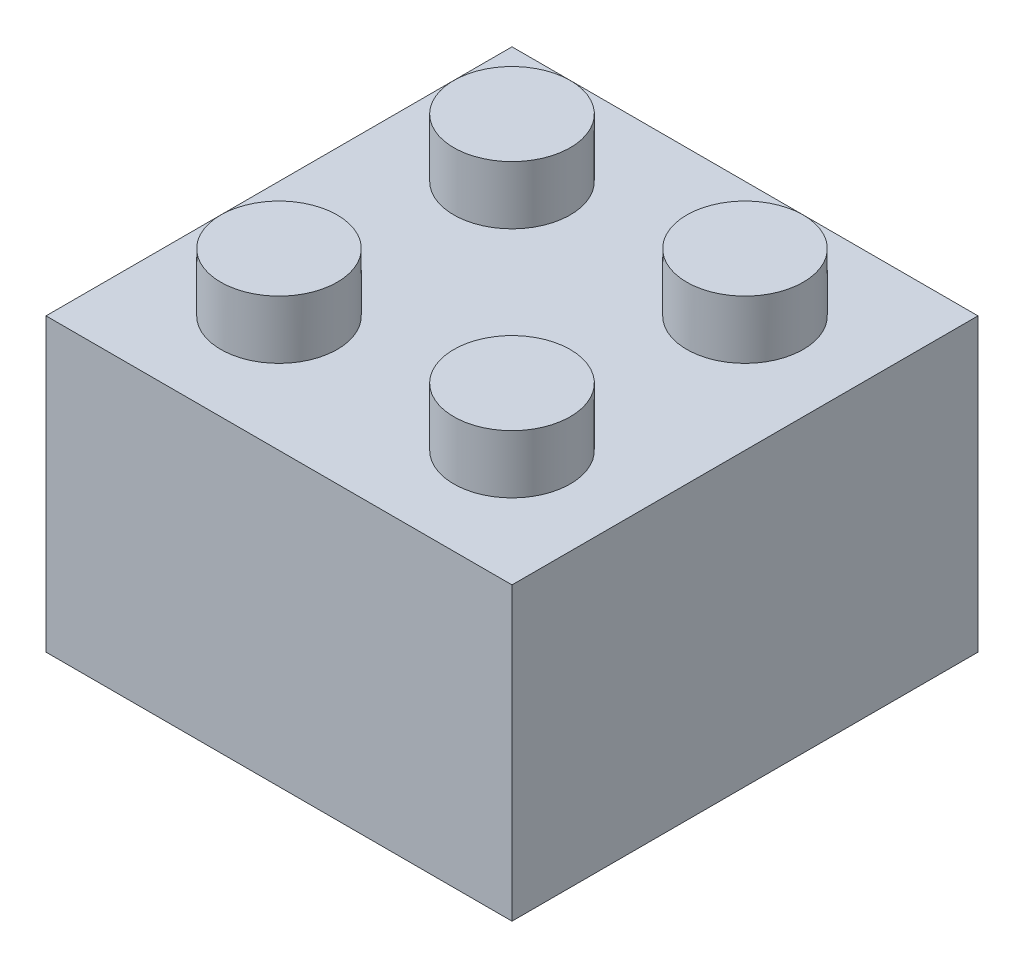
ISO-10303-21;
HEADER;
FILE_DESCRIPTION(('STEP AP214'),'2;1');
FILE_NAME('part.step','',(''),(''),'','','');
FILE_SCHEMA(('AUTOMOTIVE_DESIGN { 1 0 10303 214 1 1 1 1 }'));
ENDSEC;
DATA;
#1=APPLICATION_CONTEXT('core data for automotive mechanical design processes');
#2=APPLICATION_PROTOCOL_DEFINITION('international standard','automotive_design',2000,#1);
#3=PRODUCT_CONTEXT('',#1,'mechanical');
#4=PRODUCT('Part','Part','',(#3));
#5=PRODUCT_RELATED_PRODUCT_CATEGORY('part','',(#4));
#6=PRODUCT_DEFINITION_FORMATION('','',#4);
#7=PRODUCT_DEFINITION_CONTEXT('part definition',#1,'design');
#8=PRODUCT_DEFINITION('design','',#6,#7);
#9=PRODUCT_DEFINITION_SHAPE('','',#8);
#10=(LENGTH_UNIT() NAMED_UNIT(*) SI_UNIT(.MILLI.,.METRE.));
#11=(NAMED_UNIT(*) PLANE_ANGLE_UNIT() SI_UNIT($,.RADIAN.));
#12=(NAMED_UNIT(*) SI_UNIT($,.STERADIAN.) SOLID_ANGLE_UNIT());
#13=UNCERTAINTY_MEASURE_WITH_UNIT(LENGTH_MEASURE(1.E-05),#10,'distance_accuracy_value','');
#14=(GEOMETRIC_REPRESENTATION_CONTEXT(3) GLOBAL_UNCERTAINTY_ASSIGNED_CONTEXT((#13)) GLOBAL_UNIT_ASSIGNED_CONTEXT((#10,
#11,#12)) REPRESENTATION_CONTEXT('',''));
#15=CARTESIAN_POINT('',(0.,0.,0.));
#16=DIRECTION('',(0.,0.,1.));
#17=DIRECTION('',(1.,0.,0.));
#18=AXIS2_PLACEMENT_3D('',#15,#16,#17);
#19=CARTESIAN_POINT('',(-8.,10.,-8.));
#20=DIRECTION('',(0.,0.,-1.));
#21=DIRECTION('',(-1.,0.,0.));
#22=AXIS2_PLACEMENT_3D('',#19,#20,#21);
#23=PLANE('',#22);
#24=DIRECTION('',(1.,0.,0.));
#25=VECTOR('',#24,1.);
#26=CARTESIAN_POINT('',(-8.,0.,-8.));
#27=LINE('',#26,#25);
#28=CARTESIAN_POINT('',(-8.,0.,-8.));
#29=VERTEX_POINT('',#28);
#30=CARTESIAN_POINT('',(8.,0.,-8.));
#31=VERTEX_POINT('',#30);
#32=EDGE_CURVE('E186',#29,#31,#27,.T.);
#33=ORIENTED_EDGE('',*,*,#32,.F.);
#34=DIRECTION('',(0.,-1.,0.));
#35=VECTOR('',#34,1.);
#36=CARTESIAN_POINT('',(-8.,10.,-8.));
#37=LINE('',#36,#35);
#38=CARTESIAN_POINT('',(-8.,10.,-8.));
#39=VERTEX_POINT('',#38);
#40=EDGE_CURVE('E60',#39,#29,#37,.T.);
#41=ORIENTED_EDGE('',*,*,#40,.F.);
#42=DIRECTION('',(1.,0.,0.));
#43=VECTOR('',#42,1.);
#44=CARTESIAN_POINT('',(-8.,10.,-8.));
#45=LINE('',#44,#43);
#46=CARTESIAN_POINT('',(8.,10.,-8.));
#47=VERTEX_POINT('',#46);
#48=EDGE_CURVE('E187',#39,#47,#45,.T.);
#49=ORIENTED_EDGE('',*,*,#48,.T.);
#50=DIRECTION('',(0.,-1.,0.));
#51=VECTOR('',#50,1.);
#52=CARTESIAN_POINT('',(8.,10.,-8.));
#53=LINE('',#52,#51);
#54=EDGE_CURVE('E85',#47,#31,#53,.T.);
#55=ORIENTED_EDGE('',*,*,#54,.T.);
#56=EDGE_LOOP('',(#33,#41,#49,#55));
#57=FACE_BOUND('',#56,.T.);
#58=ADVANCED_FACE('F37',(#57),#23,.T.);
#59=CARTESIAN_POINT('',(-8.,10.,-8.));
#60=DIRECTION('',(1.,0.,0.));
#61=DIRECTION('',(0.,0.,-1.));
#62=AXIS2_PLACEMENT_3D('',#59,#60,#61);
#63=PLANE('',#62);
#64=DIRECTION('',(0.,0.,1.));
#65=VECTOR('',#64,1.);
#66=CARTESIAN_POINT('',(-8.,0.,-8.));
#67=LINE('',#66,#65);
#68=CARTESIAN_POINT('',(-8.,0.,8.));
#69=VERTEX_POINT('',#68);
#70=EDGE_CURVE('E190',#29,#69,#67,.T.);
#71=ORIENTED_EDGE('',*,*,#70,.T.);
#72=DIRECTION('',(0.,-1.,0.));
#73=VECTOR('',#72,1.);
#74=CARTESIAN_POINT('',(-8.,10.,8.));
#75=LINE('',#74,#73);
#76=CARTESIAN_POINT('',(-8.,10.,8.));
#77=VERTEX_POINT('',#76);
#78=EDGE_CURVE('E207',#77,#69,#75,.T.);
#79=ORIENTED_EDGE('',*,*,#78,.F.);
#80=DIRECTION('',(0.,0.,1.));
#81=VECTOR('',#80,1.);
#82=CARTESIAN_POINT('',(-8.,10.,-8.));
#83=LINE('',#82,#81);
#84=EDGE_CURVE('E194',#39,#77,#83,.T.);
#85=ORIENTED_EDGE('',*,*,#84,.F.);
#86=ORIENTED_EDGE('',*,*,#40,.T.);
#87=EDGE_LOOP('',(#71,#79,#85,#86));
#88=FACE_BOUND('',#87,.T.);
#89=ADVANCED_FACE('F242',(#88),#63,.F.);
#90=CARTESIAN_POINT('',(-8.,10.,8.));
#91=DIRECTION('',(0.,0.,-1.));
#92=DIRECTION('',(-1.,0.,0.));
#93=AXIS2_PLACEMENT_3D('',#90,#91,#92);
#94=PLANE('',#93);
#95=DIRECTION('',(1.,0.,0.));
#96=VECTOR('',#95,1.);
#97=CARTESIAN_POINT('',(-8.,0.,8.));
#98=LINE('',#97,#96);
#99=CARTESIAN_POINT('',(8.,0.,8.));
#100=VERTEX_POINT('',#99);
#101=EDGE_CURVE('E201',#69,#100,#98,.T.);
#102=ORIENTED_EDGE('',*,*,#101,.T.);
#103=DIRECTION('',(0.,-1.,0.));
#104=VECTOR('',#103,1.);
#105=CARTESIAN_POINT('',(8.,10.,8.));
#106=LINE('',#105,#104);
#107=CARTESIAN_POINT('',(8.,10.,8.));
#108=VERTEX_POINT('',#107);
#109=EDGE_CURVE('E210',#108,#100,#106,.T.);
#110=ORIENTED_EDGE('',*,*,#109,.F.);
#111=DIRECTION('',(1.,0.,0.));
#112=VECTOR('',#111,1.);
#113=CARTESIAN_POINT('',(-8.,10.,8.));
#114=LINE('',#113,#112);
#115=EDGE_CURVE('E192',#77,#108,#114,.T.);
#116=ORIENTED_EDGE('',*,*,#115,.F.);
#117=ORIENTED_EDGE('',*,*,#78,.T.);
#118=EDGE_LOOP('',(#102,#110,#116,#117));
#119=FACE_BOUND('',#118,.T.);
#120=ADVANCED_FACE('F245',(#119),#94,.F.);
#121=CARTESIAN_POINT('',(8.,10.,-8.));
#122=DIRECTION('',(1.,0.,0.));
#123=DIRECTION('',(0.,0.,-1.));
#124=AXIS2_PLACEMENT_3D('',#121,#122,#123);
#125=PLANE('',#124);
#126=DIRECTION('',(0.,0.,1.));
#127=VECTOR('',#126,1.);
#128=CARTESIAN_POINT('',(8.,0.,-8.));
#129=LINE('',#128,#127);
#130=EDGE_CURVE('E198',#31,#100,#129,.T.);
#131=ORIENTED_EDGE('',*,*,#130,.F.);
#132=ORIENTED_EDGE('',*,*,#54,.F.);
#133=DIRECTION('',(0.,0.,1.));
#134=VECTOR('',#133,1.);
#135=CARTESIAN_POINT('',(8.,10.,-8.));
#136=LINE('',#135,#134);
#137=EDGE_CURVE('E189',#47,#108,#136,.T.);
#138=ORIENTED_EDGE('',*,*,#137,.T.);
#139=ORIENTED_EDGE('',*,*,#109,.T.);
#140=EDGE_LOOP('',(#131,#132,#138,#139));
#141=FACE_BOUND('',#140,.T.);
#142=ADVANCED_FACE('F229',(#141),#125,.T.);
#143=CARTESIAN_POINT('',(0.,10.,0.));
#144=DIRECTION('',(0.,-1.,0.));
#145=DIRECTION('',(0.,0.,-1.));
#146=AXIS2_PLACEMENT_3D('',#143,#144,#145);
#147=PLANE('',#146);
#148=CARTESIAN_POINT('',(-4.,10.,4.));
#149=DIRECTION('',(0.,-1.,0.));
#150=DIRECTION('',(0.,0.,-1.));
#151=AXIS2_PLACEMENT_3D('',#148,#149,#150);
#152=CIRCLE('',#151,2.);
#153=CARTESIAN_POINT('',(-4.,10.,2.));
#154=VERTEX_POINT('',#153);
#155=EDGE_CURVE('E44',#154,#154,#152,.F.);
#156=ORIENTED_EDGE('',*,*,#155,.F.);
#157=EDGE_LOOP('',(#156));
#158=FACE_BOUND('',#157,.T.);
#159=CARTESIAN_POINT('',(4.,10.,4.));
#160=DIRECTION('',(0.,-1.,0.));
#161=DIRECTION('',(0.,0.,-1.));
#162=AXIS2_PLACEMENT_3D('',#159,#160,#161);
#163=CIRCLE('',#162,2.);
#164=CARTESIAN_POINT('',(4.,10.,2.));
#165=VERTEX_POINT('',#164);
#166=EDGE_CURVE('E218',#165,#165,#163,.F.);
#167=ORIENTED_EDGE('',*,*,#166,.F.);
#168=EDGE_LOOP('',(#167));
#169=FACE_BOUND('',#168,.T.);
#170=CARTESIAN_POINT('',(-4.,10.,-4.));
#171=DIRECTION('',(0.,-1.,0.));
#172=DIRECTION('',(0.,0.,-1.));
#173=AXIS2_PLACEMENT_3D('',#170,#171,#172);
#174=CIRCLE('',#173,2.);
#175=CARTESIAN_POINT('',(-4.,10.,-6.));
#176=VERTEX_POINT('',#175);
#177=EDGE_CURVE('E215',#176,#176,#174,.F.);
#178=ORIENTED_EDGE('',*,*,#177,.F.);
#179=EDGE_LOOP('',(#178));
#180=FACE_BOUND('',#179,.T.);
#181=CARTESIAN_POINT('',(4.,10.,-4.));
#182=DIRECTION('',(0.,-1.,0.));
#183=DIRECTION('',(0.,0.,-1.));
#184=AXIS2_PLACEMENT_3D('',#181,#182,#183);
#185=CIRCLE('',#184,2.);
#186=CARTESIAN_POINT('',(4.,10.,-6.));
#187=VERTEX_POINT('',#186);
#188=EDGE_CURVE('E206',#187,#187,#185,.F.);
#189=ORIENTED_EDGE('',*,*,#188,.F.);
#190=EDGE_LOOP('',(#189));
#191=FACE_BOUND('',#190,.T.);
#192=ORIENTED_EDGE('',*,*,#48,.F.);
#193=ORIENTED_EDGE('',*,*,#84,.T.);
#194=ORIENTED_EDGE('',*,*,#115,.T.);
#195=ORIENTED_EDGE('',*,*,#137,.F.);
#196=EDGE_LOOP('',(#192,#193,#194,#195));
#197=FACE_BOUND('',#196,.T.);
#198=ADVANCED_FACE('F225',(#158,#169,#180,#191,#197),#147,.F.);
#199=CARTESIAN_POINT('',(0.,0.,0.));
#200=DIRECTION('',(0.,-1.,0.));
#201=DIRECTION('',(0.,0.,-1.));
#202=AXIS2_PLACEMENT_3D('',#199,#200,#201);
#203=PLANE('',#202);
#204=DIRECTION('',(1.,0.,0.));
#205=VECTOR('',#204,1.);
#206=CARTESIAN_POINT('',(0.,0.,-7.));
#207=LINE('',#206,#205);
#208=CARTESIAN_POINT('',(-7.,0.,-7.));
#209=VERTEX_POINT('',#208);
#210=CARTESIAN_POINT('',(7.,0.,-7.));
#211=VERTEX_POINT('',#210);
#212=EDGE_CURVE('E159',#209,#211,#207,.T.);
#213=ORIENTED_EDGE('',*,*,#212,.F.);
#214=DIRECTION('',(0.,0.,1.));
#215=VECTOR('',#214,1.);
#216=CARTESIAN_POINT('',(-7.,0.,0.));
#217=LINE('',#216,#215);
#218=CARTESIAN_POINT('',(-7.,0.,7.));
#219=VERTEX_POINT('',#218);
#220=EDGE_CURVE('E114',#209,#219,#217,.T.);
#221=ORIENTED_EDGE('',*,*,#220,.T.);
#222=DIRECTION('',(1.,0.,0.));
#223=VECTOR('',#222,1.);
#224=CARTESIAN_POINT('',(0.,0.,7.));
#225=LINE('',#224,#223);
#226=CARTESIAN_POINT('',(7.,0.,7.));
#227=VERTEX_POINT('',#226);
#228=EDGE_CURVE('E51',#219,#227,#225,.T.);
#229=ORIENTED_EDGE('',*,*,#228,.T.);
#230=DIRECTION('',(0.,0.,1.));
#231=VECTOR('',#230,1.);
#232=CARTESIAN_POINT('',(7.,0.,0.));
#233=LINE('',#232,#231);
#234=EDGE_CURVE('E171',#211,#227,#233,.T.);
#235=ORIENTED_EDGE('',*,*,#234,.F.);
#236=EDGE_LOOP('',(#213,#221,#229,#235));
#237=FACE_BOUND('',#236,.T.);
#238=ORIENTED_EDGE('',*,*,#32,.T.);
#239=ORIENTED_EDGE('',*,*,#130,.T.);
#240=ORIENTED_EDGE('',*,*,#101,.F.);
#241=ORIENTED_EDGE('',*,*,#70,.F.);
#242=EDGE_LOOP('',(#238,#239,#240,#241));
#243=FACE_BOUND('',#242,.T.);
#244=ADVANCED_FACE('F228',(#237,#243),#203,.T.);
#245=CARTESIAN_POINT('',(4.,12.,-4.));
#246=DIRECTION('',(0.,-1.,0.));
#247=DIRECTION('',(0.,0.,-1.));
#248=AXIS2_PLACEMENT_3D('',#245,#246,#247);
#249=CYLINDRICAL_SURFACE('',#248,2.);
#250=CARTESIAN_POINT('',(4.,12.,-4.));
#251=DIRECTION('',(0.,1.,0.));
#252=DIRECTION('',(0.,0.,1.));
#253=AXIS2_PLACEMENT_3D('',#250,#251,#252);
#254=CIRCLE('',#253,2.);
#255=CARTESIAN_POINT('',(4.,12.,-2.));
#256=VERTEX_POINT('',#255);
#257=EDGE_CURVE('E183',#256,#256,#254,.T.);
#258=ORIENTED_EDGE('',*,*,#257,.F.);
#259=EDGE_LOOP('',(#258));
#260=FACE_BOUND('',#259,.T.);
#261=ORIENTED_EDGE('',*,*,#188,.T.);
#262=EDGE_LOOP('',(#261));
#263=FACE_BOUND('',#262,.T.);
#264=ADVANCED_FACE('F287',(#260,#263),#249,.T.);
#265=CARTESIAN_POINT('',(4.,12.,-4.));
#266=DIRECTION('',(0.,1.,0.));
#267=DIRECTION('',(0.,0.,1.));
#268=AXIS2_PLACEMENT_3D('',#265,#266,#267);
#269=PLANE('',#268);
#270=ORIENTED_EDGE('',*,*,#257,.T.);
#271=EDGE_LOOP('',(#270));
#272=FACE_BOUND('',#271,.T.);
#273=ADVANCED_FACE('F292',(#272),#269,.T.);
#274=CARTESIAN_POINT('',(-4.,12.,-4.));
#275=DIRECTION('',(0.,-1.,0.));
#276=DIRECTION('',(0.,0.,-1.));
#277=AXIS2_PLACEMENT_3D('',#274,#275,#276);
#278=CYLINDRICAL_SURFACE('',#277,2.);
#279=CARTESIAN_POINT('',(-4.,12.,-4.));
#280=DIRECTION('',(0.,1.,0.));
#281=DIRECTION('',(0.,0.,-1.));
#282=AXIS2_PLACEMENT_3D('',#279,#280,#281);
#283=CIRCLE('',#282,2.);
#284=CARTESIAN_POINT('',(-4.,12.,-6.));
#285=VERTEX_POINT('',#284);
#286=EDGE_CURVE('E180',#285,#285,#283,.T.);
#287=ORIENTED_EDGE('',*,*,#286,.F.);
#288=EDGE_LOOP('',(#287));
#289=FACE_BOUND('',#288,.T.);
#290=ORIENTED_EDGE('',*,*,#177,.T.);
#291=EDGE_LOOP('',(#290));
#292=FACE_BOUND('',#291,.T.);
#293=ADVANCED_FACE('F303',(#289,#292),#278,.T.);
#294=CARTESIAN_POINT('',(-4.,12.,-4.));
#295=DIRECTION('',(0.,-1.,0.));
#296=DIRECTION('',(0.,0.,-1.));
#297=AXIS2_PLACEMENT_3D('',#294,#295,#296);
#298=PLANE('',#297);
#299=ORIENTED_EDGE('',*,*,#286,.T.);
#300=EDGE_LOOP('',(#299));
#301=FACE_BOUND('',#300,.T.);
#302=ADVANCED_FACE('F314',(#301),#298,.F.);
#303=CARTESIAN_POINT('',(4.,12.,4.));
#304=DIRECTION('',(0.,-1.,0.));
#305=DIRECTION('',(0.,0.,-1.));
#306=AXIS2_PLACEMENT_3D('',#303,#304,#305);
#307=CYLINDRICAL_SURFACE('',#306,2.);
#308=CARTESIAN_POINT('',(4.,12.,4.));
#309=DIRECTION('',(0.,1.,0.));
#310=DIRECTION('',(0.,0.,-1.));
#311=AXIS2_PLACEMENT_3D('',#308,#309,#310);
#312=CIRCLE('',#311,2.);
#313=CARTESIAN_POINT('',(4.,12.,2.));
#314=VERTEX_POINT('',#313);
#315=EDGE_CURVE('E177',#314,#314,#312,.T.);
#316=ORIENTED_EDGE('',*,*,#315,.F.);
#317=EDGE_LOOP('',(#316));
#318=FACE_BOUND('',#317,.T.);
#319=ORIENTED_EDGE('',*,*,#166,.T.);
#320=EDGE_LOOP('',(#319));
#321=FACE_BOUND('',#320,.T.);
#322=ADVANCED_FACE('F325',(#318,#321),#307,.T.);
#323=CARTESIAN_POINT('',(4.,12.,4.));
#324=DIRECTION('',(0.,-1.,0.));
#325=DIRECTION('',(0.,0.,-1.));
#326=AXIS2_PLACEMENT_3D('',#323,#324,#325);
#327=PLANE('',#326);
#328=ORIENTED_EDGE('',*,*,#315,.T.);
#329=EDGE_LOOP('',(#328));
#330=FACE_BOUND('',#329,.T.);
#331=ADVANCED_FACE('F336',(#330),#327,.F.);
#332=CARTESIAN_POINT('',(-4.,12.,4.));
#333=DIRECTION('',(0.,-1.,0.));
#334=DIRECTION('',(0.,0.,-1.));
#335=AXIS2_PLACEMENT_3D('',#332,#333,#334);
#336=CYLINDRICAL_SURFACE('',#335,2.);
#337=CARTESIAN_POINT('',(-4.,12.,4.));
#338=DIRECTION('',(0.,1.,0.));
#339=DIRECTION('',(0.,0.,1.));
#340=AXIS2_PLACEMENT_3D('',#337,#338,#339);
#341=CIRCLE('',#340,2.);
#342=CARTESIAN_POINT('',(-4.,12.,6.));
#343=VERTEX_POINT('',#342);
#344=EDGE_CURVE('E147',#343,#343,#341,.T.);
#345=ORIENTED_EDGE('',*,*,#344,.F.);
#346=EDGE_LOOP('',(#345));
#347=FACE_BOUND('',#346,.T.);
#348=ORIENTED_EDGE('',*,*,#155,.T.);
#349=EDGE_LOOP('',(#348));
#350=FACE_BOUND('',#349,.T.);
#351=ADVANCED_FACE('F223',(#347,#350),#336,.T.);
#352=CARTESIAN_POINT('',(-4.,12.,4.));
#353=DIRECTION('',(0.,1.,0.));
#354=DIRECTION('',(0.,0.,1.));
#355=AXIS2_PLACEMENT_3D('',#352,#353,#354);
#356=PLANE('',#355);
#357=ORIENTED_EDGE('',*,*,#344,.T.);
#358=EDGE_LOOP('',(#357));
#359=FACE_BOUND('',#358,.T.);
#360=ADVANCED_FACE('F357',(#359),#356,.T.);
#361=CARTESIAN_POINT('',(-8.,10.,-7.));
#362=DIRECTION('',(0.,0.,-1.));
#363=DIRECTION('',(-1.,0.,0.));
#364=AXIS2_PLACEMENT_3D('',#361,#362,#363);
#365=PLANE('',#364);
#366=ORIENTED_EDGE('',*,*,#212,.T.);
#367=DIRECTION('',(0.,-1.,0.));
#368=VECTOR('',#367,1.);
#369=CARTESIAN_POINT('',(7.,10.,-7.));
#370=LINE('',#369,#368);
#371=CARTESIAN_POINT('',(7.,9.,-7.));
#372=VERTEX_POINT('',#371);
#373=EDGE_CURVE('E129',#372,#211,#370,.T.);
#374=ORIENTED_EDGE('',*,*,#373,.F.);
#375=DIRECTION('',(1.,0.,0.));
#376=VECTOR('',#375,1.);
#377=CARTESIAN_POINT('',(0.,9.,-7.));
#378=LINE('',#377,#376);
#379=CARTESIAN_POINT('',(-7.,9.,-7.));
#380=VERTEX_POINT('',#379);
#381=EDGE_CURVE('E127',#380,#372,#378,.T.);
#382=ORIENTED_EDGE('',*,*,#381,.F.);
#383=DIRECTION('',(0.,-1.,0.));
#384=VECTOR('',#383,1.);
#385=CARTESIAN_POINT('',(-7.,10.,-7.));
#386=LINE('',#385,#384);
#387=EDGE_CURVE('E109',#380,#209,#386,.T.);
#388=ORIENTED_EDGE('',*,*,#387,.T.);
#389=EDGE_LOOP('',(#366,#374,#382,#388));
#390=FACE_BOUND('',#389,.T.);
#391=ADVANCED_FACE('F131',(#390),#365,.F.);
#392=CARTESIAN_POINT('',(-7.,10.,-8.));
#393=DIRECTION('',(1.,0.,0.));
#394=DIRECTION('',(0.,0.,-1.));
#395=AXIS2_PLACEMENT_3D('',#392,#393,#394);
#396=PLANE('',#395);
#397=ORIENTED_EDGE('',*,*,#220,.F.);
#398=ORIENTED_EDGE('',*,*,#387,.F.);
#399=DIRECTION('',(0.,0.,1.));
#400=VECTOR('',#399,1.);
#401=CARTESIAN_POINT('',(-7.,9.,0.));
#402=LINE('',#401,#400);
#403=CARTESIAN_POINT('',(-7.,9.,7.));
#404=VERTEX_POINT('',#403);
#405=EDGE_CURVE('E112',#380,#404,#402,.T.);
#406=ORIENTED_EDGE('',*,*,#405,.T.);
#407=DIRECTION('',(0.,-1.,0.));
#408=VECTOR('',#407,1.);
#409=CARTESIAN_POINT('',(-7.,10.,7.));
#410=LINE('',#409,#408);
#411=EDGE_CURVE('E120',#404,#219,#410,.T.);
#412=ORIENTED_EDGE('',*,*,#411,.T.);
#413=EDGE_LOOP('',(#397,#398,#406,#412));
#414=FACE_BOUND('',#413,.T.);
#415=ADVANCED_FACE('F111',(#414),#396,.T.);
#416=CARTESIAN_POINT('',(-8.,10.,7.));
#417=DIRECTION('',(0.,0.,-1.));
#418=DIRECTION('',(-1.,0.,0.));
#419=AXIS2_PLACEMENT_3D('',#416,#417,#418);
#420=PLANE('',#419);
#421=ORIENTED_EDGE('',*,*,#228,.F.);
#422=ORIENTED_EDGE('',*,*,#411,.F.);
#423=DIRECTION('',(1.,0.,0.));
#424=VECTOR('',#423,1.);
#425=CARTESIAN_POINT('',(0.,9.,7.));
#426=LINE('',#425,#424);
#427=CARTESIAN_POINT('',(7.,9.,7.));
#428=VERTEX_POINT('',#427);
#429=EDGE_CURVE('E128',#404,#428,#426,.T.);
#430=ORIENTED_EDGE('',*,*,#429,.T.);
#431=DIRECTION('',(0.,-1.,0.));
#432=VECTOR('',#431,1.);
#433=CARTESIAN_POINT('',(7.,10.,7.));
#434=LINE('',#433,#432);
#435=EDGE_CURVE('E140',#428,#227,#434,.T.);
#436=ORIENTED_EDGE('',*,*,#435,.T.);
#437=EDGE_LOOP('',(#421,#422,#430,#436));
#438=FACE_BOUND('',#437,.T.);
#439=ADVANCED_FACE('F395',(#438),#420,.T.);
#440=CARTESIAN_POINT('',(7.,10.,-8.));
#441=DIRECTION('',(1.,0.,0.));
#442=DIRECTION('',(0.,0.,-1.));
#443=AXIS2_PLACEMENT_3D('',#440,#441,#442);
#444=PLANE('',#443);
#445=ORIENTED_EDGE('',*,*,#234,.T.);
#446=ORIENTED_EDGE('',*,*,#435,.F.);
#447=DIRECTION('',(0.,0.,1.));
#448=VECTOR('',#447,1.);
#449=CARTESIAN_POINT('',(7.,9.,0.));
#450=LINE('',#449,#448);
#451=EDGE_CURVE('E133',#372,#428,#450,.T.);
#452=ORIENTED_EDGE('',*,*,#451,.F.);
#453=ORIENTED_EDGE('',*,*,#373,.T.);
#454=EDGE_LOOP('',(#445,#446,#452,#453));
#455=FACE_BOUND('',#454,.T.);
#456=ADVANCED_FACE('F405',(#455),#444,.F.);
#457=CARTESIAN_POINT('',(0.,9.,0.));
#458=DIRECTION('',(0.,-1.,0.));
#459=DIRECTION('',(0.,0.,-1.));
#460=AXIS2_PLACEMENT_3D('',#457,#458,#459);
#461=PLANE('',#460);
#462=CARTESIAN_POINT('',(0.,9.,0.));
#463=DIRECTION('',(0.,-1.,0.));
#464=DIRECTION('',(0.,0.,-1.));
#465=AXIS2_PLACEMENT_3D('',#462,#463,#464);
#466=CIRCLE('',#465,2.7);
#467=CARTESIAN_POINT('',(0.,9.,-2.7));
#468=VERTEX_POINT('',#467);
#469=EDGE_CURVE('E601',#468,#468,#466,.T.);
#470=ORIENTED_EDGE('',*,*,#469,.F.);
#471=EDGE_LOOP('',(#470));
#472=FACE_BOUND('',#471,.T.);
#473=CARTESIAN_POINT('',(-4.,9.,4.));
#474=DIRECTION('',(0.,-1.,0.));
#475=DIRECTION('',(0.,0.,-1.));
#476=AXIS2_PLACEMENT_3D('',#473,#474,#475);
#477=CIRCLE('',#476,1.);
#478=CARTESIAN_POINT('',(-4.,9.,3.));
#479=VERTEX_POINT('',#478);
#480=EDGE_CURVE('E144',#479,#479,#477,.F.);
#481=ORIENTED_EDGE('',*,*,#480,.T.);
#482=EDGE_LOOP('',(#481));
#483=FACE_BOUND('',#482,.T.);
#484=CARTESIAN_POINT('',(4.,9.,4.));
#485=DIRECTION('',(0.,-1.,0.));
#486=DIRECTION('',(0.,0.,-1.));
#487=AXIS2_PLACEMENT_3D('',#484,#485,#486);
#488=CIRCLE('',#487,1.);
#489=CARTESIAN_POINT('',(4.,9.,3.));
#490=VERTEX_POINT('',#489);
#491=EDGE_CURVE('E148',#490,#490,#488,.F.);
#492=ORIENTED_EDGE('',*,*,#491,.T.);
#493=EDGE_LOOP('',(#492));
#494=FACE_BOUND('',#493,.T.);
#495=CARTESIAN_POINT('',(-4.,9.,-4.));
#496=DIRECTION('',(0.,-1.,0.));
#497=DIRECTION('',(0.,0.,-1.));
#498=AXIS2_PLACEMENT_3D('',#495,#496,#497);
#499=CIRCLE('',#498,1.);
#500=CARTESIAN_POINT('',(-4.,9.,-5.));
#501=VERTEX_POINT('',#500);
#502=EDGE_CURVE('E151',#501,#501,#499,.F.);
#503=ORIENTED_EDGE('',*,*,#502,.T.);
#504=EDGE_LOOP('',(#503));
#505=FACE_BOUND('',#504,.T.);
#506=CARTESIAN_POINT('',(4.,9.,-4.));
#507=DIRECTION('',(0.,-1.,0.));
#508=DIRECTION('',(0.,0.,-1.));
#509=AXIS2_PLACEMENT_3D('',#506,#507,#508);
#510=CIRCLE('',#509,1.);
#511=CARTESIAN_POINT('',(4.,9.,-5.));
#512=VERTEX_POINT('',#511);
#513=EDGE_CURVE('E119',#512,#512,#510,.F.);
#514=ORIENTED_EDGE('',*,*,#513,.T.);
#515=EDGE_LOOP('',(#514));
#516=FACE_BOUND('',#515,.T.);
#517=ORIENTED_EDGE('',*,*,#381,.T.);
#518=ORIENTED_EDGE('',*,*,#451,.T.);
#519=ORIENTED_EDGE('',*,*,#429,.F.);
#520=ORIENTED_EDGE('',*,*,#405,.F.);
#521=EDGE_LOOP('',(#517,#518,#519,#520));
#522=FACE_BOUND('',#521,.T.);
#523=ADVANCED_FACE('F125',(#472,#483,#494,#505,#516,#522),#461,.T.);
#524=CARTESIAN_POINT('',(4.,12.,-4.));
#525=DIRECTION('',(0.,-1.,0.));
#526=DIRECTION('',(0.,0.,-1.));
#527=AXIS2_PLACEMENT_3D('',#524,#525,#526);
#528=CYLINDRICAL_SURFACE('',#527,1.);
#529=CARTESIAN_POINT('',(4.,11.,-4.));
#530=DIRECTION('',(0.,1.,0.));
#531=DIRECTION('',(0.,0.,1.));
#532=AXIS2_PLACEMENT_3D('',#529,#530,#531);
#533=CIRCLE('',#532,1.);
#534=CARTESIAN_POINT('',(4.,11.,-3.));
#535=VERTEX_POINT('',#534);
#536=EDGE_CURVE('E156',#535,#535,#533,.T.);
#537=ORIENTED_EDGE('',*,*,#536,.T.);
#538=EDGE_LOOP('',(#537));
#539=FACE_BOUND('',#538,.T.);
#540=ORIENTED_EDGE('',*,*,#513,.F.);
#541=EDGE_LOOP('',(#540));
#542=FACE_BOUND('',#541,.T.);
#543=ADVANCED_FACE('F423',(#539,#542),#528,.F.);
#544=CARTESIAN_POINT('',(4.,11.,-4.));
#545=DIRECTION('',(0.,1.,0.));
#546=DIRECTION('',(0.,0.,1.));
#547=AXIS2_PLACEMENT_3D('',#544,#545,#546);
#548=PLANE('',#547);
#549=ORIENTED_EDGE('',*,*,#536,.F.);
#550=EDGE_LOOP('',(#549));
#551=FACE_BOUND('',#550,.T.);
#552=ADVANCED_FACE('F428',(#551),#548,.F.);
#553=CARTESIAN_POINT('',(-4.,12.,-4.));
#554=DIRECTION('',(0.,-1.,0.));
#555=DIRECTION('',(0.,0.,-1.));
#556=AXIS2_PLACEMENT_3D('',#553,#554,#555);
#557=CYLINDRICAL_SURFACE('',#556,1.);
#558=CARTESIAN_POINT('',(-4.,11.,-4.));
#559=DIRECTION('',(0.,-1.,0.));
#560=DIRECTION('',(0.,0.,-1.));
#561=AXIS2_PLACEMENT_3D('',#558,#559,#560);
#562=CIRCLE('',#561,1.);
#563=CARTESIAN_POINT('',(-4.,11.,-5.));
#564=VERTEX_POINT('',#563);
#565=EDGE_CURVE('E160',#564,#564,#562,.F.);
#566=ORIENTED_EDGE('',*,*,#565,.T.);
#567=EDGE_LOOP('',(#566));
#568=FACE_BOUND('',#567,.T.);
#569=ORIENTED_EDGE('',*,*,#502,.F.);
#570=EDGE_LOOP('',(#569));
#571=FACE_BOUND('',#570,.T.);
#572=ADVANCED_FACE('F439',(#568,#571),#557,.F.);
#573=CARTESIAN_POINT('',(-4.,11.,-4.));
#574=DIRECTION('',(0.,-1.,0.));
#575=DIRECTION('',(0.,0.,-1.));
#576=AXIS2_PLACEMENT_3D('',#573,#574,#575);
#577=PLANE('',#576);
#578=ORIENTED_EDGE('',*,*,#565,.F.);
#579=EDGE_LOOP('',(#578));
#580=FACE_BOUND('',#579,.T.);
#581=ADVANCED_FACE('F450',(#580),#577,.T.);
#582=CARTESIAN_POINT('',(4.,12.,4.));
#583=DIRECTION('',(0.,-1.,0.));
#584=DIRECTION('',(0.,0.,-1.));
#585=AXIS2_PLACEMENT_3D('',#582,#583,#584);
#586=CYLINDRICAL_SURFACE('',#585,1.);
#587=CARTESIAN_POINT('',(4.,11.,4.));
#588=DIRECTION('',(0.,-1.,0.));
#589=DIRECTION('',(0.,0.,-1.));
#590=AXIS2_PLACEMENT_3D('',#587,#588,#589);
#591=CIRCLE('',#590,1.);
#592=CARTESIAN_POINT('',(4.,11.,3.));
#593=VERTEX_POINT('',#592);
#594=EDGE_CURVE('E163',#593,#593,#591,.F.);
#595=ORIENTED_EDGE('',*,*,#594,.T.);
#596=EDGE_LOOP('',(#595));
#597=FACE_BOUND('',#596,.T.);
#598=ORIENTED_EDGE('',*,*,#491,.F.);
#599=EDGE_LOOP('',(#598));
#600=FACE_BOUND('',#599,.T.);
#601=ADVANCED_FACE('F461',(#597,#600),#586,.F.);
#602=CARTESIAN_POINT('',(4.,11.,4.));
#603=DIRECTION('',(0.,-1.,0.));
#604=DIRECTION('',(0.,0.,-1.));
#605=AXIS2_PLACEMENT_3D('',#602,#603,#604);
#606=PLANE('',#605);
#607=ORIENTED_EDGE('',*,*,#594,.F.);
#608=EDGE_LOOP('',(#607));
#609=FACE_BOUND('',#608,.T.);
#610=ADVANCED_FACE('F472',(#609),#606,.T.);
#611=CARTESIAN_POINT('',(-4.,12.,4.));
#612=DIRECTION('',(0.,-1.,0.));
#613=DIRECTION('',(0.,0.,-1.));
#614=AXIS2_PLACEMENT_3D('',#611,#612,#613);
#615=CYLINDRICAL_SURFACE('',#614,1.);
#616=CARTESIAN_POINT('',(-4.,11.,4.));
#617=DIRECTION('',(0.,1.,0.));
#618=DIRECTION('',(0.,0.,1.));
#619=AXIS2_PLACEMENT_3D('',#616,#617,#618);
#620=CIRCLE('',#619,1.);
#621=CARTESIAN_POINT('',(-4.,11.,5.));
#622=VERTEX_POINT('',#621);
#623=EDGE_CURVE('E166',#622,#622,#620,.T.);
#624=ORIENTED_EDGE('',*,*,#623,.T.);
#625=EDGE_LOOP('',(#624));
#626=FACE_BOUND('',#625,.T.);
#627=ORIENTED_EDGE('',*,*,#480,.F.);
#628=EDGE_LOOP('',(#627));
#629=FACE_BOUND('',#628,.T.);
#630=ADVANCED_FACE('F483',(#626,#629),#615,.F.);
#631=CARTESIAN_POINT('',(-4.,11.,4.));
#632=DIRECTION('',(0.,1.,0.));
#633=DIRECTION('',(0.,0.,1.));
#634=AXIS2_PLACEMENT_3D('',#631,#632,#633);
#635=PLANE('',#634);
#636=ORIENTED_EDGE('',*,*,#623,.F.);
#637=EDGE_LOOP('',(#636));
#638=FACE_BOUND('',#637,.T.);
#639=ADVANCED_FACE('F494',(#638),#635,.F.);
#640=CARTESIAN_POINT('',(0.,0.,0.));
#641=DIRECTION('',(0.,-1.,0.));
#642=DIRECTION('',(0.,0.,-1.));
#643=AXIS2_PLACEMENT_3D('',#640,#641,#642);
#644=PLANE('',#643);
#645=CARTESIAN_POINT('',(0.,0.,0.));
#646=DIRECTION('',(0.,-1.,0.));
#647=DIRECTION('',(0.,0.,-1.));
#648=AXIS2_PLACEMENT_3D('',#645,#646,#647);
#649=CIRCLE('',#648,2.7);
#650=CARTESIAN_POINT('',(0.,0.,-2.7));
#651=VERTEX_POINT('',#650);
#652=EDGE_CURVE('E169',#651,#651,#649,.T.);
#653=ORIENTED_EDGE('',*,*,#652,.T.);
#654=EDGE_LOOP('',(#653));
#655=FACE_BOUND('',#654,.T.);
#656=CARTESIAN_POINT('',(0.,0.,0.));
#657=DIRECTION('',(0.,-1.,0.));
#658=DIRECTION('',(0.,0.,-1.));
#659=AXIS2_PLACEMENT_3D('',#656,#657,#658);
#660=CIRCLE('',#659,1.7);
#661=CARTESIAN_POINT('',(0.,0.,-1.7));
#662=VERTEX_POINT('',#661);
#663=EDGE_CURVE('E599',#662,#662,#660,.T.);
#664=ORIENTED_EDGE('',*,*,#663,.F.);
#665=EDGE_LOOP('',(#664));
#666=FACE_BOUND('',#665,.T.);
#667=ADVANCED_FACE('F505',(#655,#666),#644,.T.);
#668=CARTESIAN_POINT('',(0.,0.,0.));
#669=DIRECTION('',(0.,1.,0.));
#670=DIRECTION('',(0.,0.,1.));
#671=AXIS2_PLACEMENT_3D('',#668,#669,#670);
#672=CYLINDRICAL_SURFACE('',#671,2.7);
#673=ORIENTED_EDGE('',*,*,#652,.F.);
#674=EDGE_LOOP('',(#673));
#675=FACE_BOUND('',#674,.T.);
#676=ORIENTED_EDGE('',*,*,#469,.T.);
#677=EDGE_LOOP('',(#676));
#678=FACE_BOUND('',#677,.T.);
#679=ADVANCED_FACE('F526',(#675,#678),#672,.T.);
#680=CARTESIAN_POINT('',(0.,0.,0.));
#681=DIRECTION('',(0.,1.,0.));
#682=DIRECTION('',(0.,0.,1.));
#683=AXIS2_PLACEMENT_3D('',#680,#681,#682);
#684=CYLINDRICAL_SURFACE('',#683,1.7);
#685=ORIENTED_EDGE('',*,*,#663,.T.);
#686=EDGE_LOOP('',(#685));
#687=FACE_BOUND('',#686,.T.);
#688=CARTESIAN_POINT('',(0.,9.,0.));
#689=DIRECTION('',(0.,-1.,0.));
#690=DIRECTION('',(0.,0.,-1.));
#691=AXIS2_PLACEMENT_3D('',#688,#689,#690);
#692=CIRCLE('',#691,1.7);
#693=CARTESIAN_POINT('',(0.,9.,-1.7));
#694=VERTEX_POINT('',#693);
#695=EDGE_CURVE('E11',#694,#694,#692,.F.);
#696=ORIENTED_EDGE('',*,*,#695,.T.);
#697=EDGE_LOOP('',(#696));
#698=FACE_BOUND('',#697,.T.);
#699=ADVANCED_FACE('F537',(#687,#698),#684,.F.);
#700=ORIENTED_EDGE('',*,*,#695,.F.);
#701=EDGE_LOOP('',(#700));
#702=FACE_BOUND('',#701,.T.);
#703=ADVANCED_FACE('F518',(#702),#461,.T.);
#704=CLOSED_SHELL('',(#58,#89,#120,#142,#198,#244,#264,#273,#293,#302,#322,#331,#351,#360,#391,
#415,#439,#456,#523,#543,#552,#572,#581,#601,#610,#630,#639,#667,#679,#699,#703));
#705=MANIFOLD_SOLID_BREP('B2',#704);
#706=ADVANCED_BREP_SHAPE_REPRESENTATION('',(#18,#705),#14);
#707=SHAPE_DEFINITION_REPRESENTATION(#9,#706);
ENDSEC;
END-ISO-10303-21;
